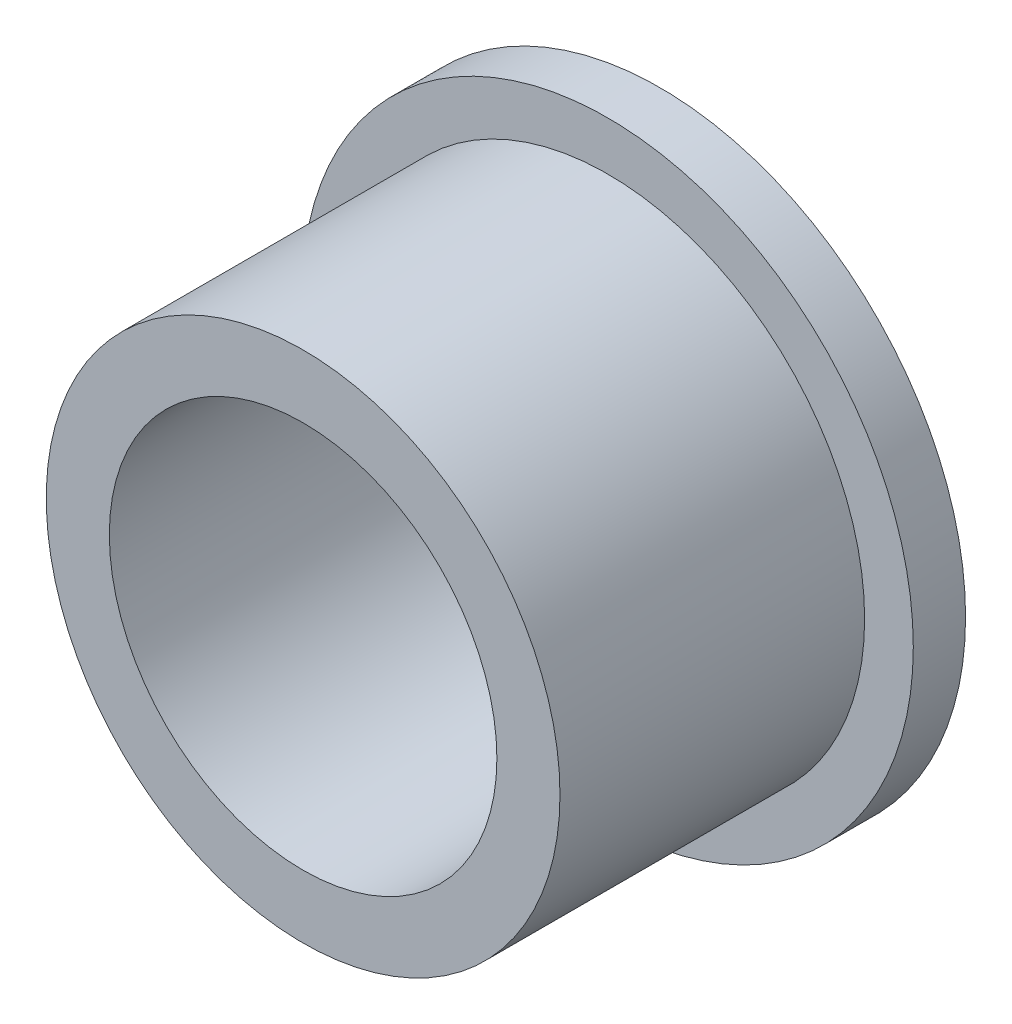
ISO-10303-21;
HEADER;
FILE_DESCRIPTION(('STEP AP214'),'2;1');
FILE_NAME('part.step','',(''),(''),'','','');
FILE_SCHEMA(('AUTOMOTIVE_DESIGN { 1 0 10303 214 1 1 1 1 }'));
ENDSEC;
DATA;
#1=APPLICATION_CONTEXT('core data for automotive mechanical design processes');
#2=APPLICATION_PROTOCOL_DEFINITION('international standard','automotive_design',2000,#1);
#3=PRODUCT_CONTEXT('',#1,'mechanical');
#4=PRODUCT('Part','Part','',(#3));
#5=PRODUCT_RELATED_PRODUCT_CATEGORY('part','',(#4));
#6=PRODUCT_DEFINITION_FORMATION('','',#4);
#7=PRODUCT_DEFINITION_CONTEXT('part definition',#1,'design');
#8=PRODUCT_DEFINITION('design','',#6,#7);
#9=PRODUCT_DEFINITION_SHAPE('','',#8);
#10=(LENGTH_UNIT() NAMED_UNIT(*) SI_UNIT(.MILLI.,.METRE.));
#11=(NAMED_UNIT(*) PLANE_ANGLE_UNIT() SI_UNIT($,.RADIAN.));
#12=(NAMED_UNIT(*) SI_UNIT($,.STERADIAN.) SOLID_ANGLE_UNIT());
#13=UNCERTAINTY_MEASURE_WITH_UNIT(LENGTH_MEASURE(1.E-05),#10,'distance_accuracy_value','');
#14=(GEOMETRIC_REPRESENTATION_CONTEXT(3) GLOBAL_UNCERTAINTY_ASSIGNED_CONTEXT((#13)) GLOBAL_UNIT_ASSIGNED_CONTEXT((#10,
#11,#12)) REPRESENTATION_CONTEXT('',''));
#15=CARTESIAN_POINT('',(0.,0.,0.));
#16=DIRECTION('',(0.,0.,1.));
#17=DIRECTION('',(1.,0.,0.));
#18=AXIS2_PLACEMENT_3D('',#15,#16,#17);
#19=CARTESIAN_POINT('',(0.,0.,2.9));
#20=DIRECTION('',(0.,0.,-1.));
#21=DIRECTION('',(-1.,0.,0.));
#22=AXIS2_PLACEMENT_3D('',#19,#20,#21);
#23=CYLINDRICAL_SURFACE('',#22,16.95);
#24=CARTESIAN_POINT('',(0.,0.,2.9));
#25=DIRECTION('',(0.,0.,1.));
#26=DIRECTION('',(1.,0.,0.));
#27=AXIS2_PLACEMENT_3D('',#24,#25,#26);
#28=CIRCLE('',#27,16.95);
#29=CARTESIAN_POINT('',(16.95,0.,2.9));
#30=VERTEX_POINT('',#29);
#31=EDGE_CURVE('E10',#30,#30,#28,.T.);
#32=ORIENTED_EDGE('',*,*,#31,.F.);
#33=EDGE_LOOP('',(#32));
#34=FACE_BOUND('',#33,.T.);
#35=CARTESIAN_POINT('',(0.,0.,0.));
#36=DIRECTION('',(0.,0.,1.));
#37=DIRECTION('',(1.,0.,0.));
#38=AXIS2_PLACEMENT_3D('',#35,#36,#37);
#39=CIRCLE('',#38,16.95);
#40=CARTESIAN_POINT('',(16.95,0.,0.));
#41=VERTEX_POINT('',#40);
#42=EDGE_CURVE('E52',#41,#41,#39,.T.);
#43=ORIENTED_EDGE('',*,*,#42,.T.);
#44=EDGE_LOOP('',(#43));
#45=FACE_BOUND('',#44,.T.);
#46=ADVANCED_FACE('F39',(#34,#45),#23,.T.);
#47=CARTESIAN_POINT('',(0.,0.,2.9));
#48=DIRECTION('',(0.,0.,-1.));
#49=DIRECTION('',(-1.,0.,0.));
#50=AXIS2_PLACEMENT_3D('',#47,#48,#49);
#51=CYLINDRICAL_SURFACE('',#50,10.75);
#52=CARTESIAN_POINT('',(0.,0.,0.));
#53=DIRECTION('',(0.,0.,1.));
#54=DIRECTION('',(1.,0.,0.));
#55=AXIS2_PLACEMENT_3D('',#52,#53,#54);
#56=CIRCLE('',#55,10.75);
#57=CARTESIAN_POINT('',(10.75,0.,0.));
#58=VERTEX_POINT('',#57);
#59=EDGE_CURVE('E42',#58,#58,#56,.T.);
#60=ORIENTED_EDGE('',*,*,#59,.F.);
#61=EDGE_LOOP('',(#60));
#62=FACE_BOUND('',#61,.T.);
#63=CARTESIAN_POINT('',(0.,0.,19.8));
#64=DIRECTION('',(0.,0.,1.));
#65=DIRECTION('',(1.,0.,0.));
#66=AXIS2_PLACEMENT_3D('',#63,#64,#65);
#67=CIRCLE('',#66,10.75);
#68=CARTESIAN_POINT('',(10.75,0.,19.8));
#69=VERTEX_POINT('',#68);
#70=EDGE_CURVE('E63',#69,#69,#67,.F.);
#71=ORIENTED_EDGE('',*,*,#70,.F.);
#72=EDGE_LOOP('',(#71));
#73=FACE_BOUND('',#72,.T.);
#74=ADVANCED_FACE('F80',(#62,#73),#51,.F.);
#75=CARTESIAN_POINT('',(0.,0.,2.9));
#76=DIRECTION('',(0.,0.,1.));
#77=DIRECTION('',(1.,0.,0.));
#78=AXIS2_PLACEMENT_3D('',#75,#76,#77);
#79=PLANE('',#78);
#80=CARTESIAN_POINT('',(0.,0.,2.9));
#81=DIRECTION('',(0.,0.,1.));
#82=DIRECTION('',(1.,0.,0.));
#83=AXIS2_PLACEMENT_3D('',#80,#81,#82);
#84=CIRCLE('',#83,14.25);
#85=CARTESIAN_POINT('',(14.25,0.,2.9));
#86=VERTEX_POINT('',#85);
#87=EDGE_CURVE('E54',#86,#86,#84,.T.);
#88=ORIENTED_EDGE('',*,*,#87,.F.);
#89=EDGE_LOOP('',(#88));
#90=FACE_BOUND('',#89,.T.);
#91=ORIENTED_EDGE('',*,*,#31,.T.);
#92=EDGE_LOOP('',(#91));
#93=FACE_BOUND('',#92,.T.);
#94=ADVANCED_FACE('F77',(#90,#93),#79,.T.);
#95=CARTESIAN_POINT('',(0.,0.,0.));
#96=DIRECTION('',(0.,0.,1.));
#97=DIRECTION('',(1.,0.,0.));
#98=AXIS2_PLACEMENT_3D('',#95,#96,#97);
#99=PLANE('',#98);
#100=ORIENTED_EDGE('',*,*,#42,.F.);
#101=EDGE_LOOP('',(#100));
#102=FACE_BOUND('',#101,.T.);
#103=ORIENTED_EDGE('',*,*,#59,.T.);
#104=EDGE_LOOP('',(#103));
#105=FACE_BOUND('',#104,.T.);
#106=ADVANCED_FACE('F79',(#102,#105),#99,.F.);
#107=CARTESIAN_POINT('',(0.,0.,19.8));
#108=DIRECTION('',(0.,0.,-1.));
#109=DIRECTION('',(-1.,0.,0.));
#110=AXIS2_PLACEMENT_3D('',#107,#108,#109);
#111=CYLINDRICAL_SURFACE('',#110,14.25);
#112=CARTESIAN_POINT('',(0.,0.,19.8));
#113=DIRECTION('',(0.,0.,1.));
#114=DIRECTION('',(1.,0.,0.));
#115=AXIS2_PLACEMENT_3D('',#112,#113,#114);
#116=CIRCLE('',#115,14.25);
#117=CARTESIAN_POINT('',(14.25,0.,19.8));
#118=VERTEX_POINT('',#117);
#119=EDGE_CURVE('E58',#118,#118,#116,.T.);
#120=ORIENTED_EDGE('',*,*,#119,.F.);
#121=EDGE_LOOP('',(#120));
#122=FACE_BOUND('',#121,.T.);
#123=ORIENTED_EDGE('',*,*,#87,.T.);
#124=EDGE_LOOP('',(#123));
#125=FACE_BOUND('',#124,.T.);
#126=ADVANCED_FACE('F75',(#122,#125),#111,.T.);
#127=CARTESIAN_POINT('',(0.,0.,19.8));
#128=DIRECTION('',(0.,0.,1.));
#129=DIRECTION('',(1.,0.,0.));
#130=AXIS2_PLACEMENT_3D('',#127,#128,#129);
#131=PLANE('',#130);
#132=ORIENTED_EDGE('',*,*,#70,.T.);
#133=EDGE_LOOP('',(#132));
#134=FACE_BOUND('',#133,.T.);
#135=ORIENTED_EDGE('',*,*,#119,.T.);
#136=EDGE_LOOP('',(#135));
#137=FACE_BOUND('',#136,.T.);
#138=ADVANCED_FACE('F117',(#134,#137),#131,.T.);
#139=CLOSED_SHELL('',(#46,#74,#94,#106,#126,#138));
#140=MANIFOLD_SOLID_BREP('B2',#139);
#141=ADVANCED_BREP_SHAPE_REPRESENTATION('',(#18,#140),#14);
#142=SHAPE_DEFINITION_REPRESENTATION(#9,#141);
ENDSEC;
END-ISO-10303-21;
